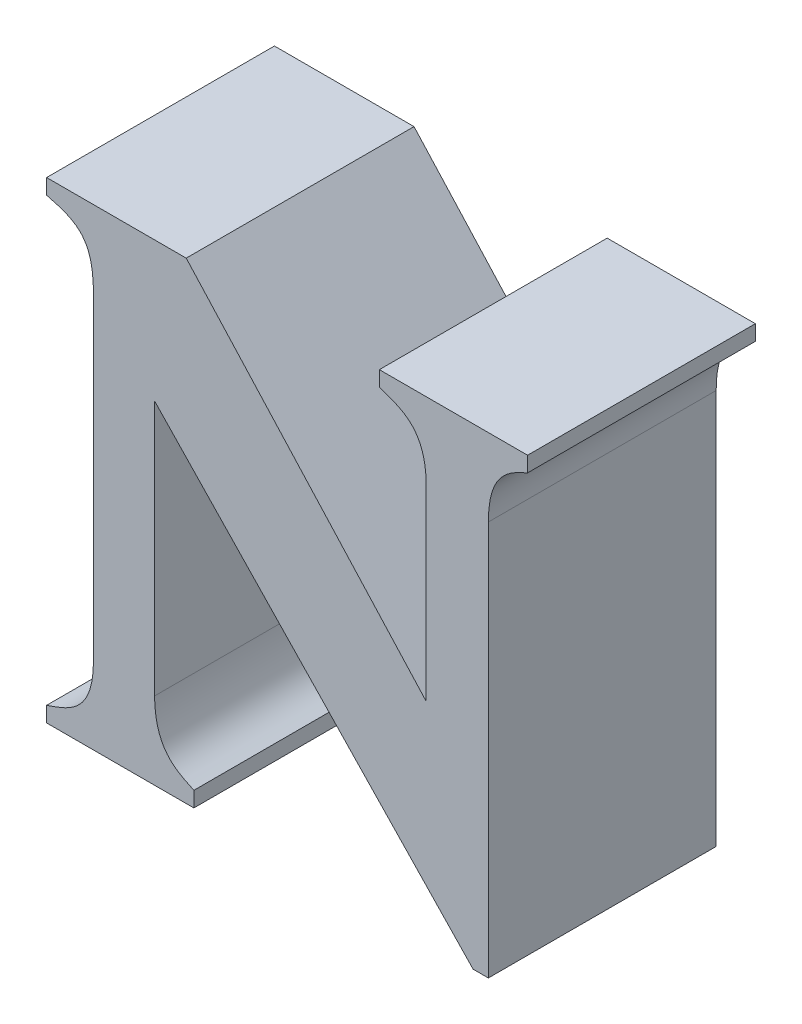
ISO-10303-21;
HEADER;
FILE_DESCRIPTION(('STEP AP214'),'2;1');
FILE_NAME('part.step','',(''),(''),'','','');
FILE_SCHEMA(('AUTOMOTIVE_DESIGN { 1 0 10303 214 1 1 1 1 }'));
ENDSEC;
DATA;
#1=APPLICATION_CONTEXT('core data for automotive mechanical design processes');
#2=APPLICATION_PROTOCOL_DEFINITION('international standard','automotive_design',2000,#1);
#3=PRODUCT_CONTEXT('',#1,'mechanical');
#4=PRODUCT('Part','Part','',(#3));
#5=PRODUCT_RELATED_PRODUCT_CATEGORY('part','',(#4));
#6=PRODUCT_DEFINITION_FORMATION('','',#4);
#7=PRODUCT_DEFINITION_CONTEXT('part definition',#1,'design');
#8=PRODUCT_DEFINITION('design','',#6,#7);
#9=PRODUCT_DEFINITION_SHAPE('','',#8);
#10=(LENGTH_UNIT() NAMED_UNIT(*) SI_UNIT(.MILLI.,.METRE.));
#11=(NAMED_UNIT(*) PLANE_ANGLE_UNIT() SI_UNIT($,.RADIAN.));
#12=(NAMED_UNIT(*) SI_UNIT($,.STERADIAN.) SOLID_ANGLE_UNIT());
#13=UNCERTAINTY_MEASURE_WITH_UNIT(LENGTH_MEASURE(1.E-05),#10,'distance_accuracy_value','');
#14=(GEOMETRIC_REPRESENTATION_CONTEXT(3) GLOBAL_UNCERTAINTY_ASSIGNED_CONTEXT((#13)) GLOBAL_UNIT_ASSIGNED_CONTEXT((#10,
#11,#12)) REPRESENTATION_CONTEXT('',''));
#15=CARTESIAN_POINT('',(0.,0.,0.));
#16=DIRECTION('',(0.,0.,1.));
#17=DIRECTION('',(1.,0.,0.));
#18=AXIS2_PLACEMENT_3D('',#15,#16,#17);
#19=CARTESIAN_POINT('',(2.447592086115,-0.453859050516,0.));
#20=DIRECTION('',(-1.,0.,0.));
#21=DIRECTION('',(0.,-1.,0.));
#22=AXIS2_PLACEMENT_3D('',#19,#20,#21);
#23=PLANE('',#22);
#24=DIRECTION('',(0.,1.,0.));
#25=VECTOR('',#24,1.);
#26=CARTESIAN_POINT('',(2.447592086115,-0.46057454398,0.));
#27=LINE('',#26,#25);
#28=CARTESIAN_POINT('',(2.447592086115,-0.46057454398,0.));
#29=VERTEX_POINT('',#28);
#30=CARTESIAN_POINT('',(2.447592086115,-0.453859050516,0.));
#31=VERTEX_POINT('',#30);
#32=EDGE_CURVE('E11',#29,#31,#27,.T.);
#33=ORIENTED_EDGE('',*,*,#32,.F.);
#34=DIRECTION('',(0.,0.,1.));
#35=VECTOR('',#34,1.);
#36=CARTESIAN_POINT('',(2.447592086115,-0.46057454398,0.));
#37=LINE('',#36,#35);
#38=CARTESIAN_POINT('',(2.447592086115,-0.46057454398,0.1));
#39=VERTEX_POINT('',#38);
#40=EDGE_CURVE('E24',#29,#39,#37,.T.);
#41=ORIENTED_EDGE('',*,*,#40,.T.);
#42=DIRECTION('',(0.,-1.,0.));
#43=VECTOR('',#42,1.);
#44=CARTESIAN_POINT('',(2.447592086115,-0.46057454398,0.1));
#45=LINE('',#44,#43);
#46=CARTESIAN_POINT('',(2.447592086115,-0.453859050516,0.1));
#47=VERTEX_POINT('',#46);
#48=EDGE_CURVE('E172',#47,#39,#45,.T.);
#49=ORIENTED_EDGE('',*,*,#48,.F.);
#50=DIRECTION('',(0.,0.,1.));
#51=VECTOR('',#50,1.);
#52=CARTESIAN_POINT('',(2.447592086115,-0.453859050516,0.));
#53=LINE('',#52,#51);
#54=EDGE_CURVE('E356',#31,#47,#53,.T.);
#55=ORIENTED_EDGE('',*,*,#54,.F.);
#56=EDGE_LOOP('',(#33,#41,#49,#55));
#57=FACE_BOUND('',#56,.T.);
#58=ADVANCED_FACE('F17',(#57),#23,.T.);
#59=CARTESIAN_POINT('',(2.468158415474,-0.426577508445,0.));
#60=CARTESIAN_POINT('',(2.468158415474,-0.426577508445,0.1));
#61=CARTESIAN_POINT('',(2.468158415474,-0.447143557053,0.));
#62=CARTESIAN_POINT('',(2.468158415474,-0.447143557053,0.1));
#63=CARTESIAN_POINT('',(2.457665778633,-0.450501256992,0.));
#64=CARTESIAN_POINT('',(2.457665778633,-0.450501256992,0.1));
#65=CARTESIAN_POINT('',(2.447592086115,-0.453859050516,0.));
#66=CARTESIAN_POINT('',(2.447592086115,-0.453859050516,0.1));
#67=B_SPLINE_SURFACE_WITH_KNOTS('',3,1,((#59,#60),(#61,#62),(#63,#64),(#65,#66)),.UNSPECIFIED.,
.F.,.F.,.F.,(4,4),(2,2),(-1.,0.),(0.,0.01),.UNSPECIFIED.);
#68=CARTESIAN_POINT('',(2.447592086115,-0.453859050516,0.));
#69=CARTESIAN_POINT('',(2.457665778633,-0.450501256992,0.));
#70=CARTESIAN_POINT('',(2.468158415474,-0.447143557053,0.));
#71=CARTESIAN_POINT('',(2.468158415474,-0.426577508445,0.));
#72=B_SPLINE_CURVE_WITH_KNOTS('',3,(#68,#69,#70,#71),.UNSPECIFIED.,.F.,.F.,(4,4),(0.,1.),.UNSPECIFIED.);
#73=CARTESIAN_POINT('',(2.468158415474,-0.426577508445,0.));
#74=VERTEX_POINT('',#73);
#75=EDGE_CURVE('E349',#31,#74,#72,.T.);
#76=CARTESIAN_POINT('',(2.468158415474,-0.426577508445,0.1));
#77=CARTESIAN_POINT('',(2.468158415474,-0.447143557053,0.1));
#78=CARTESIAN_POINT('',(2.457665778633,-0.450501256992,0.1));
#79=CARTESIAN_POINT('',(2.447592086115,-0.453859050516,0.1));
#80=B_SPLINE_CURVE_WITH_KNOTS('',3,(#76,#77,#78,#79),.UNSPECIFIED.,.F.,.F.,(4,4),(-1.,0.),.UNSPECIFIED.);
#81=CARTESIAN_POINT('',(2.468158415474,-0.426577508445,0.1));
#82=VERTEX_POINT('',#81);
#83=EDGE_CURVE('E345',#82,#47,#80,.T.);
#84=DIRECTION('',(0.,0.,1.));
#85=VECTOR('',#84,1.);
#86=CARTESIAN_POINT('',(2.468158415474,-0.426577508445,0.));
#87=LINE('',#86,#85);
#88=EDGE_CURVE('E342',#74,#82,#87,.T.);
#89=ORIENTED_EDGE('',*,*,#75,.F.);
#90=ORIENTED_EDGE('',*,*,#54,.T.);
#91=ORIENTED_EDGE('',*,*,#83,.F.);
#92=ORIENTED_EDGE('',*,*,#88,.F.);
#93=EDGE_LOOP('',(#89,#90,#91,#92));
#94=FACE_BOUND('',#93,.T.);
#95=ADVANCED_FACE('F429',(#94),#67,.T.);
#96=CARTESIAN_POINT('',(2.468158415474,-0.28723157278345,0.));
#97=DIRECTION('',(-1.,0.,0.));
#98=DIRECTION('',(0.,-1.,0.));
#99=AXIS2_PLACEMENT_3D('',#96,#97,#98);
#100=PLANE('',#99);
#101=DIRECTION('',(0.,1.,0.));
#102=VECTOR('',#101,1.);
#103=CARTESIAN_POINT('',(2.468158415474,-0.426577508445,0.));
#104=LINE('',#103,#102);
#105=CARTESIAN_POINT('',(2.468158415474,-0.28723157278345,0.));
#106=VERTEX_POINT('',#105);
#107=EDGE_CURVE('E340',#74,#106,#104,.T.);
#108=ORIENTED_EDGE('',*,*,#107,.F.);
#109=ORIENTED_EDGE('',*,*,#88,.T.);
#110=DIRECTION('',(0.,-1.,0.));
#111=VECTOR('',#110,1.);
#112=CARTESIAN_POINT('',(2.468158415474,-0.426577508445,0.1));
#113=LINE('',#112,#111);
#114=CARTESIAN_POINT('',(2.468158415474,-0.28723157278345,0.1));
#115=VERTEX_POINT('',#114);
#116=EDGE_CURVE('E337',#115,#82,#113,.T.);
#117=ORIENTED_EDGE('',*,*,#116,.F.);
#118=DIRECTION('',(0.,0.,1.));
#119=VECTOR('',#118,1.);
#120=CARTESIAN_POINT('',(2.468158415474,-0.28723157278345,0.));
#121=LINE('',#120,#119);
#122=EDGE_CURVE('E331',#106,#115,#121,.T.);
#123=ORIENTED_EDGE('',*,*,#122,.F.);
#124=EDGE_LOOP('',(#108,#109,#117,#123));
#125=FACE_BOUND('',#124,.T.);
#126=ADVANCED_FACE('F425',(#125),#100,.T.);
#127=CARTESIAN_POINT('',(2.447592086115,-0.25995003071244,0.));
#128=CARTESIAN_POINT('',(2.447592086115,-0.25995003071244,0.1));
#129=CARTESIAN_POINT('',(2.461022948263,-0.26330769945751,0.));
#130=CARTESIAN_POINT('',(2.461022948263,-0.26330769945751,0.1));
#131=CARTESIAN_POINT('',(2.468158415474,-0.26666549298124,0.));
#132=CARTESIAN_POINT('',(2.468158415474,-0.26666549298124,0.1));
#133=CARTESIAN_POINT('',(2.468158415474,-0.28723157278345,0.));
#134=CARTESIAN_POINT('',(2.468158415474,-0.28723157278345,0.1));
#135=B_SPLINE_SURFACE_WITH_KNOTS('',3,1,((#127,#128),(#129,#130),(#131,#132),(#133,#134)),
.UNSPECIFIED.,.F.,.F.,.F.,(4,4),(2,2),(-1.,0.),(0.,0.01),.UNSPECIFIED.);
#136=CARTESIAN_POINT('',(2.468158415474,-0.28723157278345,0.));
#137=CARTESIAN_POINT('',(2.468158415474,-0.26666549298124,0.));
#138=CARTESIAN_POINT('',(2.461022948263,-0.26330769945751,0.));
#139=CARTESIAN_POINT('',(2.447592086115,-0.25995003071244,0.));
#140=B_SPLINE_CURVE_WITH_KNOTS('',3,(#136,#137,#138,#139),.UNSPECIFIED.,.F.,.F.,(4,4),(0.,1.),.UNSPECIFIED.);
#141=CARTESIAN_POINT('',(2.447592086115,-0.25995003071244,0.));
#142=VERTEX_POINT('',#141);
#143=EDGE_CURVE('E324',#106,#142,#140,.T.);
#144=CARTESIAN_POINT('',(2.447592086115,-0.25995003071244,0.1));
#145=CARTESIAN_POINT('',(2.461022948263,-0.26330769945751,0.1));
#146=CARTESIAN_POINT('',(2.468158415474,-0.26666549298124,0.1));
#147=CARTESIAN_POINT('',(2.468158415474,-0.28723157278345,0.1));
#148=B_SPLINE_CURVE_WITH_KNOTS('',3,(#144,#145,#146,#147),.UNSPECIFIED.,.F.,.F.,(4,4),(-1.,0.),.UNSPECIFIED.);
#149=CARTESIAN_POINT('',(2.447592086115,-0.25995003071244,0.1));
#150=VERTEX_POINT('',#149);
#151=EDGE_CURVE('E319',#150,#115,#148,.T.);
#152=DIRECTION('',(0.,0.,1.));
#153=VECTOR('',#152,1.);
#154=CARTESIAN_POINT('',(2.447592086115,-0.25995003071244,0.));
#155=LINE('',#154,#153);
#156=EDGE_CURVE('E316',#142,#150,#155,.T.);
#157=ORIENTED_EDGE('',*,*,#143,.F.);
#158=ORIENTED_EDGE('',*,*,#122,.T.);
#159=ORIENTED_EDGE('',*,*,#151,.F.);
#160=ORIENTED_EDGE('',*,*,#156,.F.);
#161=EDGE_LOOP('',(#157,#158,#159,#160));
#162=FACE_BOUND('',#161,.T.);
#163=ADVANCED_FACE('F421',(#162),#135,.T.);
#164=CARTESIAN_POINT('',(2.447592086115,-0.25323453724898,0.));
#165=DIRECTION('',(-1.,0.,0.));
#166=DIRECTION('',(0.,-1.,0.));
#167=AXIS2_PLACEMENT_3D('',#164,#165,#166);
#168=PLANE('',#167);
#169=DIRECTION('',(0.,1.,0.));
#170=VECTOR('',#169,1.);
#171=CARTESIAN_POINT('',(2.447592086115,-0.25995003071244,0.));
#172=LINE('',#171,#170);
#173=CARTESIAN_POINT('',(2.447592086115,-0.25323453724898,0.));
#174=VERTEX_POINT('',#173);
#175=EDGE_CURVE('E314',#142,#174,#172,.T.);
#176=ORIENTED_EDGE('',*,*,#175,.F.);
#177=ORIENTED_EDGE('',*,*,#156,.T.);
#178=DIRECTION('',(0.,-1.,0.));
#179=VECTOR('',#178,1.);
#180=CARTESIAN_POINT('',(2.447592086115,-0.25995003071244,0.1));
#181=LINE('',#180,#179);
#182=CARTESIAN_POINT('',(2.447592086115,-0.25323453724898,0.1));
#183=VERTEX_POINT('',#182);
#184=EDGE_CURVE('E311',#183,#150,#181,.T.);
#185=ORIENTED_EDGE('',*,*,#184,.F.);
#186=DIRECTION('',(0.,0.,1.));
#187=VECTOR('',#186,1.);
#188=CARTESIAN_POINT('',(2.447592086115,-0.25323453724898,0.));
#189=LINE('',#188,#187);
#190=EDGE_CURVE('E308',#174,#183,#189,.T.);
#191=ORIENTED_EDGE('',*,*,#190,.F.);
#192=EDGE_LOOP('',(#176,#177,#185,#191));
#193=FACE_BOUND('',#192,.T.);
#194=ADVANCED_FACE('F417',(#193),#168,.T.);
#195=CARTESIAN_POINT('',(2.508870570136,-0.25323453724898,0.));
#196=DIRECTION('',(0.,1.,0.));
#197=DIRECTION('',(-1.,0.,0.));
#198=AXIS2_PLACEMENT_3D('',#195,#196,#197);
#199=PLANE('',#198);
#200=DIRECTION('',(1.,0.,0.));
#201=VECTOR('',#200,1.);
#202=CARTESIAN_POINT('',(2.447592086115,-0.25323453724898,0.));
#203=LINE('',#202,#201);
#204=CARTESIAN_POINT('',(2.508870570136,-0.25323453724898,0.));
#205=VERTEX_POINT('',#204);
#206=EDGE_CURVE('E306',#174,#205,#203,.T.);
#207=ORIENTED_EDGE('',*,*,#206,.F.);
#208=ORIENTED_EDGE('',*,*,#190,.T.);
#209=DIRECTION('',(-1.,0.,0.));
#210=VECTOR('',#209,1.);
#211=CARTESIAN_POINT('',(2.447592086115,-0.25323453724898,0.1));
#212=LINE('',#211,#210);
#213=CARTESIAN_POINT('',(2.508870570136,-0.25323453724898,0.1));
#214=VERTEX_POINT('',#213);
#215=EDGE_CURVE('E303',#214,#183,#212,.T.);
#216=ORIENTED_EDGE('',*,*,#215,.F.);
#217=DIRECTION('',(0.,0.,1.));
#218=VECTOR('',#217,1.);
#219=CARTESIAN_POINT('',(2.508870570136,-0.25323453724898,0.));
#220=LINE('',#219,#218);
#221=EDGE_CURVE('E300',#205,#214,#220,.T.);
#222=ORIENTED_EDGE('',*,*,#221,.F.);
#223=EDGE_LOOP('',(#207,#208,#216,#222));
#224=FACE_BOUND('',#223,.T.);
#225=ADVANCED_FACE('F413',(#224),#199,.T.);
#226=CARTESIAN_POINT('',(2.614219626237,-0.369076323775,0.));
#227=DIRECTION('',(0.73981818348661,0.672806848495594,0.));
#228=DIRECTION('',(-0.672806848495594,0.73981818348661,0.));
#229=AXIS2_PLACEMENT_3D('',#226,#227,#228);
#230=PLANE('',#229);
#231=DIRECTION('',(0.672806848495594,-0.73981818348661,0.));
#232=VECTOR('',#231,1.);
#233=CARTESIAN_POINT('',(2.508870570136,-0.25323453724898,0.));
#234=LINE('',#233,#232);
#235=CARTESIAN_POINT('',(2.614219626237,-0.369076323775,0.));
#236=VERTEX_POINT('',#235);
#237=EDGE_CURVE('E298',#205,#236,#234,.T.);
#238=ORIENTED_EDGE('',*,*,#237,.F.);
#239=ORIENTED_EDGE('',*,*,#221,.T.);
#240=DIRECTION('',(-0.672806848495594,0.73981818348661,0.));
#241=VECTOR('',#240,1.);
#242=CARTESIAN_POINT('',(2.508870570136,-0.25323453724898,0.1));
#243=LINE('',#242,#241);
#244=CARTESIAN_POINT('',(2.614219626237,-0.369076323775,0.1));
#245=VERTEX_POINT('',#244);
#246=EDGE_CURVE('E295',#245,#214,#243,.T.);
#247=ORIENTED_EDGE('',*,*,#246,.F.);
#248=DIRECTION('',(0.,0.,1.));
#249=VECTOR('',#248,1.);
#250=CARTESIAN_POINT('',(2.614219626237,-0.369076323775,0.));
#251=LINE('',#250,#249);
#252=EDGE_CURVE('E292',#236,#245,#251,.T.);
#253=ORIENTED_EDGE('',*,*,#252,.F.);
#254=EDGE_LOOP('',(#238,#239,#247,#253));
#255=FACE_BOUND('',#254,.T.);
#256=ADVANCED_FACE('F409',(#255),#230,.T.);
#257=CARTESIAN_POINT('',(2.614219626237,-0.28723157278345,0.));
#258=DIRECTION('',(-1.,0.,0.));
#259=DIRECTION('',(0.,-1.,0.));
#260=AXIS2_PLACEMENT_3D('',#257,#258,#259);
#261=PLANE('',#260);
#262=DIRECTION('',(0.,1.,0.));
#263=VECTOR('',#262,1.);
#264=CARTESIAN_POINT('',(2.614219626237,-0.369076323775,0.));
#265=LINE('',#264,#263);
#266=CARTESIAN_POINT('',(2.614219626237,-0.28723157278345,0.));
#267=VERTEX_POINT('',#266);
#268=EDGE_CURVE('E290',#236,#267,#265,.T.);
#269=ORIENTED_EDGE('',*,*,#268,.F.);
#270=ORIENTED_EDGE('',*,*,#252,.T.);
#271=DIRECTION('',(0.,-1.,0.));
#272=VECTOR('',#271,1.);
#273=CARTESIAN_POINT('',(2.614219626237,-0.369076323775,0.1));
#274=LINE('',#273,#272);
#275=CARTESIAN_POINT('',(2.614219626237,-0.28723157278345,0.1));
#276=VERTEX_POINT('',#275);
#277=EDGE_CURVE('E287',#276,#245,#274,.T.);
#278=ORIENTED_EDGE('',*,*,#277,.F.);
#279=DIRECTION('',(0.,0.,1.));
#280=VECTOR('',#279,1.);
#281=CARTESIAN_POINT('',(2.614219626237,-0.28723157278345,0.));
#282=LINE('',#281,#280);
#283=EDGE_CURVE('E281',#267,#276,#282,.T.);
#284=ORIENTED_EDGE('',*,*,#283,.F.);
#285=EDGE_LOOP('',(#269,#270,#278,#284));
#286=FACE_BOUND('',#285,.T.);
#287=ADVANCED_FACE('F405',(#286),#261,.T.);
#288=CARTESIAN_POINT('',(2.593653608824,-0.25995003071244,0.));
#289=CARTESIAN_POINT('',(2.593653608824,-0.25995003071244,0.1));
#290=CARTESIAN_POINT('',(2.604145933719,-0.26330769945751,0.));
#291=CARTESIAN_POINT('',(2.604145933719,-0.26330769945751,0.1));
#292=CARTESIAN_POINT('',(2.614219626237,-0.26666549298124,0.));
#293=CARTESIAN_POINT('',(2.614219626237,-0.26666549298124,0.1));
#294=CARTESIAN_POINT('',(2.614219626237,-0.28723157278345,0.));
#295=CARTESIAN_POINT('',(2.614219626237,-0.28723157278345,0.1));
#296=B_SPLINE_SURFACE_WITH_KNOTS('',3,1,((#288,#289),(#290,#291),(#292,#293),(#294,#295)),
.UNSPECIFIED.,.F.,.F.,.F.,(4,4),(2,2),(-1.,0.),(0.,0.01),.UNSPECIFIED.);
#297=CARTESIAN_POINT('',(2.614219626237,-0.28723157278345,0.));
#298=CARTESIAN_POINT('',(2.614219626237,-0.26666549298124,0.));
#299=CARTESIAN_POINT('',(2.604145933719,-0.26330769945751,0.));
#300=CARTESIAN_POINT('',(2.593653608824,-0.25995003071244,0.));
#301=B_SPLINE_CURVE_WITH_KNOTS('',3,(#297,#298,#299,#300),.UNSPECIFIED.,.F.,.F.,(4,4),(0.,1.),.UNSPECIFIED.);
#302=CARTESIAN_POINT('',(2.593653608824,-0.25995003071244,0.));
#303=VERTEX_POINT('',#302);
#304=EDGE_CURVE('E274',#267,#303,#301,.T.);
#305=CARTESIAN_POINT('',(2.593653608824,-0.25995003071244,0.1));
#306=CARTESIAN_POINT('',(2.604145933719,-0.26330769945751,0.1));
#307=CARTESIAN_POINT('',(2.614219626237,-0.26666549298124,0.1));
#308=CARTESIAN_POINT('',(2.614219626237,-0.28723157278345,0.1));
#309=B_SPLINE_CURVE_WITH_KNOTS('',3,(#305,#306,#307,#308),.UNSPECIFIED.,.F.,.F.,(4,4),(-1.,0.),.UNSPECIFIED.);
#310=CARTESIAN_POINT('',(2.593653608824,-0.25995003071244,0.1));
#311=VERTEX_POINT('',#310);
#312=EDGE_CURVE('E269',#311,#276,#309,.T.);
#313=DIRECTION('',(0.,0.,1.));
#314=VECTOR('',#313,1.);
#315=CARTESIAN_POINT('',(2.593653608824,-0.25995003071244,0.));
#316=LINE('',#315,#314);
#317=EDGE_CURVE('E266',#303,#311,#316,.T.);
#318=ORIENTED_EDGE('',*,*,#304,.F.);
#319=ORIENTED_EDGE('',*,*,#283,.T.);
#320=ORIENTED_EDGE('',*,*,#312,.F.);
#321=ORIENTED_EDGE('',*,*,#317,.F.);
#322=EDGE_LOOP('',(#318,#319,#320,#321));
#323=FACE_BOUND('',#322,.T.);
#324=ADVANCED_FACE('F401',(#323),#296,.T.);
#325=CARTESIAN_POINT('',(2.593653608824,-0.25323453724898,0.));
#326=DIRECTION('',(-1.,0.,0.));
#327=DIRECTION('',(0.,-1.,0.));
#328=AXIS2_PLACEMENT_3D('',#325,#326,#327);
#329=PLANE('',#328);
#330=DIRECTION('',(0.,1.,0.));
#331=VECTOR('',#330,1.);
#332=CARTESIAN_POINT('',(2.593653608824,-0.25995003071244,0.));
#333=LINE('',#332,#331);
#334=CARTESIAN_POINT('',(2.593653608824,-0.25323453724898,0.));
#335=VERTEX_POINT('',#334);
#336=EDGE_CURVE('E264',#303,#335,#333,.T.);
#337=ORIENTED_EDGE('',*,*,#336,.F.);
#338=ORIENTED_EDGE('',*,*,#317,.T.);
#339=DIRECTION('',(0.,-1.,0.));
#340=VECTOR('',#339,1.);
#341=CARTESIAN_POINT('',(2.593653608824,-0.25995003071244,0.1));
#342=LINE('',#341,#340);
#343=CARTESIAN_POINT('',(2.593653608824,-0.25323453724898,0.1));
#344=VERTEX_POINT('',#343);
#345=EDGE_CURVE('E261',#344,#311,#342,.T.);
#346=ORIENTED_EDGE('',*,*,#345,.F.);
#347=DIRECTION('',(0.,0.,1.));
#348=VECTOR('',#347,1.);
#349=CARTESIAN_POINT('',(2.593653608824,-0.25323453724898,0.));
#350=LINE('',#349,#348);
#351=EDGE_CURVE('E258',#335,#344,#350,.T.);
#352=ORIENTED_EDGE('',*,*,#351,.F.);
#353=EDGE_LOOP('',(#337,#338,#346,#352));
#354=FACE_BOUND('',#353,.T.);
#355=ADVANCED_FACE('F397',(#354),#329,.T.);
#356=CARTESIAN_POINT('',(2.65870914264,-0.25323453724898,0.));
#357=DIRECTION('',(0.,1.,0.));
#358=DIRECTION('',(-1.,0.,0.));
#359=AXIS2_PLACEMENT_3D('',#356,#357,#358);
#360=PLANE('',#359);
#361=DIRECTION('',(1.,0.,0.));
#362=VECTOR('',#361,1.);
#363=CARTESIAN_POINT('',(2.593653608824,-0.25323453724898,0.));
#364=LINE('',#363,#362);
#365=CARTESIAN_POINT('',(2.65870914264,-0.25323453724898,0.));
#366=VERTEX_POINT('',#365);
#367=EDGE_CURVE('E256',#335,#366,#364,.T.);
#368=ORIENTED_EDGE('',*,*,#367,.F.);
#369=ORIENTED_EDGE('',*,*,#351,.T.);
#370=DIRECTION('',(-1.,0.,0.));
#371=VECTOR('',#370,1.);
#372=CARTESIAN_POINT('',(2.593653608824,-0.25323453724898,0.1));
#373=LINE('',#372,#371);
#374=CARTESIAN_POINT('',(2.65870914264,-0.25323453724898,0.1));
#375=VERTEX_POINT('',#374);
#376=EDGE_CURVE('E253',#375,#344,#373,.T.);
#377=ORIENTED_EDGE('',*,*,#376,.F.);
#378=DIRECTION('',(0.,0.,1.));
#379=VECTOR('',#378,1.);
#380=CARTESIAN_POINT('',(2.65870914264,-0.25323453724898,0.));
#381=LINE('',#380,#379);
#382=EDGE_CURVE('E250',#366,#375,#381,.T.);
#383=ORIENTED_EDGE('',*,*,#382,.F.);
#384=EDGE_LOOP('',(#368,#369,#377,#383));
#385=FACE_BOUND('',#384,.T.);
#386=ADVANCED_FACE('F393',(#385),#360,.T.);
#387=CARTESIAN_POINT('',(2.65870914264,-0.25995003071244,0.));
#388=DIRECTION('',(1.,0.,0.));
#389=DIRECTION('',(0.,1.,0.));
#390=AXIS2_PLACEMENT_3D('',#387,#388,#389);
#391=PLANE('',#390);
#392=DIRECTION('',(0.,-1.,0.));
#393=VECTOR('',#392,1.);
#394=CARTESIAN_POINT('',(2.65870914264,-0.25323453724898,0.));
#395=LINE('',#394,#393);
#396=CARTESIAN_POINT('',(2.65870914264,-0.25995003071244,0.));
#397=VERTEX_POINT('',#396);
#398=EDGE_CURVE('E248',#366,#397,#395,.T.);
#399=ORIENTED_EDGE('',*,*,#398,.F.);
#400=ORIENTED_EDGE('',*,*,#382,.T.);
#401=DIRECTION('',(0.,1.,0.));
#402=VECTOR('',#401,1.);
#403=CARTESIAN_POINT('',(2.65870914264,-0.25323453724898,0.1));
#404=LINE('',#403,#402);
#405=CARTESIAN_POINT('',(2.65870914264,-0.25995003071244,0.1));
#406=VERTEX_POINT('',#405);
#407=EDGE_CURVE('E245',#406,#375,#404,.T.);
#408=ORIENTED_EDGE('',*,*,#407,.F.);
#409=DIRECTION('',(0.,0.,1.));
#410=VECTOR('',#409,1.);
#411=CARTESIAN_POINT('',(2.65870914264,-0.25995003071244,0.));
#412=LINE('',#411,#410);
#413=EDGE_CURVE('E239',#397,#406,#412,.T.);
#414=ORIENTED_EDGE('',*,*,#413,.F.);
#415=EDGE_LOOP('',(#399,#400,#408,#414));
#416=FACE_BOUND('',#415,.T.);
#417=ADVANCED_FACE('F389',(#416),#391,.T.);
#418=CARTESIAN_POINT('',(2.641501230697,-0.28723157278345,0.));
#419=CARTESIAN_POINT('',(2.641501230697,-0.28723157278345,0.1));
#420=CARTESIAN_POINT('',(2.641501230697,-0.26666549298124,0.));
#421=CARTESIAN_POINT('',(2.641501230697,-0.26666549298124,0.1));
#422=CARTESIAN_POINT('',(2.651574923215,-0.26330769945751,0.));
#423=CARTESIAN_POINT('',(2.651574923215,-0.26330769945751,0.1));
#424=CARTESIAN_POINT('',(2.65870914264,-0.25995003071244,0.));
#425=CARTESIAN_POINT('',(2.65870914264,-0.25995003071244,0.1));
#426=B_SPLINE_SURFACE_WITH_KNOTS('',3,1,((#418,#419),(#420,#421),(#422,#423),(#424,#425)),
.UNSPECIFIED.,.F.,.F.,.F.,(4,4),(2,2),(-1.,0.),(0.,0.01),.UNSPECIFIED.);
#427=CARTESIAN_POINT('',(2.65870914264,-0.25995003071244,0.));
#428=CARTESIAN_POINT('',(2.651574923215,-0.26330769945751,0.));
#429=CARTESIAN_POINT('',(2.641501230697,-0.26666549298124,0.));
#430=CARTESIAN_POINT('',(2.641501230697,-0.28723157278345,0.));
#431=B_SPLINE_CURVE_WITH_KNOTS('',3,(#427,#428,#429,#430),.UNSPECIFIED.,.F.,.F.,(4,4),(0.,1.),.UNSPECIFIED.);
#432=CARTESIAN_POINT('',(2.641501230697,-0.28723157278345,0.));
#433=VERTEX_POINT('',#432);
#434=EDGE_CURVE('E232',#397,#433,#431,.T.);
#435=CARTESIAN_POINT('',(2.641501230697,-0.28723157278345,0.1));
#436=CARTESIAN_POINT('',(2.641501230697,-0.26666549298124,0.1));
#437=CARTESIAN_POINT('',(2.651574923215,-0.26330769945751,0.1));
#438=CARTESIAN_POINT('',(2.65870914264,-0.25995003071244,0.1));
#439=B_SPLINE_CURVE_WITH_KNOTS('',3,(#435,#436,#437,#438),.UNSPECIFIED.,.F.,.F.,(4,4),(-1.,0.),.UNSPECIFIED.);
#440=CARTESIAN_POINT('',(2.641501230697,-0.28723157278345,0.1));
#441=VERTEX_POINT('',#440);
#442=EDGE_CURVE('E227',#441,#406,#439,.T.);
#443=DIRECTION('',(0.,0.,1.));
#444=VECTOR('',#443,1.);
#445=CARTESIAN_POINT('',(2.641501230697,-0.28723157278345,0.));
#446=LINE('',#445,#444);
#447=EDGE_CURVE('E224',#433,#441,#446,.T.);
#448=ORIENTED_EDGE('',*,*,#434,.F.);
#449=ORIENTED_EDGE('',*,*,#413,.T.);
#450=ORIENTED_EDGE('',*,*,#442,.F.);
#451=ORIENTED_EDGE('',*,*,#447,.F.);
#452=EDGE_LOOP('',(#448,#449,#450,#451));
#453=FACE_BOUND('',#452,.T.);
#454=ADVANCED_FACE('F385',(#453),#426,.T.);
#455=CARTESIAN_POINT('',(2.641501230697,-0.46057454398,0.));
#456=DIRECTION('',(1.,0.,0.));
#457=DIRECTION('',(0.,1.,0.));
#458=AXIS2_PLACEMENT_3D('',#455,#456,#457);
#459=PLANE('',#458);
#460=DIRECTION('',(0.,-1.,0.));
#461=VECTOR('',#460,1.);
#462=CARTESIAN_POINT('',(2.641501230697,-0.28723157278345,0.));
#463=LINE('',#462,#461);
#464=CARTESIAN_POINT('',(2.641501230697,-0.46057454398,0.));
#465=VERTEX_POINT('',#464);
#466=EDGE_CURVE('E222',#433,#465,#463,.T.);
#467=ORIENTED_EDGE('',*,*,#466,.F.);
#468=ORIENTED_EDGE('',*,*,#447,.T.);
#469=DIRECTION('',(0.,1.,0.));
#470=VECTOR('',#469,1.);
#471=CARTESIAN_POINT('',(2.641501230697,-0.28723157278345,0.1));
#472=LINE('',#471,#470);
#473=CARTESIAN_POINT('',(2.641501230697,-0.46057454398,0.1));
#474=VERTEX_POINT('',#473);
#475=EDGE_CURVE('E219',#474,#441,#472,.T.);
#476=ORIENTED_EDGE('',*,*,#475,.F.);
#477=DIRECTION('',(0.,0.,1.));
#478=VECTOR('',#477,1.);
#479=CARTESIAN_POINT('',(2.641501230697,-0.46057454398,0.));
#480=LINE('',#479,#478);
#481=EDGE_CURVE('E216',#465,#474,#480,.T.);
#482=ORIENTED_EDGE('',*,*,#481,.F.);
#483=EDGE_LOOP('',(#467,#468,#476,#482));
#484=FACE_BOUND('',#483,.T.);
#485=ADVANCED_FACE('F381',(#484),#459,.T.);
#486=CARTESIAN_POINT('',(2.634785955596,-0.46057454398,0.));
#487=DIRECTION('',(0.,-1.,0.));
#488=DIRECTION('',(1.,0.,0.));
#489=AXIS2_PLACEMENT_3D('',#486,#487,#488);
#490=PLANE('',#489);
#491=DIRECTION('',(-1.,0.,0.));
#492=VECTOR('',#491,1.);
#493=CARTESIAN_POINT('',(2.641501230697,-0.46057454398,0.));
#494=LINE('',#493,#492);
#495=CARTESIAN_POINT('',(2.634785955596,-0.46057454398,0.));
#496=VERTEX_POINT('',#495);
#497=EDGE_CURVE('E214',#465,#496,#494,.T.);
#498=ORIENTED_EDGE('',*,*,#497,.F.);
#499=ORIENTED_EDGE('',*,*,#481,.T.);
#500=DIRECTION('',(1.,0.,0.));
#501=VECTOR('',#500,1.);
#502=CARTESIAN_POINT('',(2.641501230697,-0.46057454398,0.1));
#503=LINE('',#502,#501);
#504=CARTESIAN_POINT('',(2.634785955596,-0.46057454398,0.1));
#505=VERTEX_POINT('',#504);
#506=EDGE_CURVE('E211',#505,#474,#503,.T.);
#507=ORIENTED_EDGE('',*,*,#506,.F.);
#508=DIRECTION('',(0.,0.,1.));
#509=VECTOR('',#508,1.);
#510=CARTESIAN_POINT('',(2.634785955596,-0.46057454398,0.));
#511=LINE('',#510,#509);
#512=EDGE_CURVE('E208',#496,#505,#511,.T.);
#513=ORIENTED_EDGE('',*,*,#512,.F.);
#514=EDGE_LOOP('',(#498,#499,#507,#513));
#515=FACE_BOUND('',#514,.T.);
#516=ADVANCED_FACE('F377',(#515),#490,.T.);
#517=CARTESIAN_POINT('',(2.495019827824,-0.314513114854,0.));
#518=DIRECTION('',(-0.722505463033566,-0.69136521165492,0.));
#519=DIRECTION('',(0.69136521165492,-0.722505463033566,0.));
#520=AXIS2_PLACEMENT_3D('',#517,#518,#519);
#521=PLANE('',#520);
#522=DIRECTION('',(-0.69136521165492,0.722505463033566,0.));
#523=VECTOR('',#522,1.);
#524=CARTESIAN_POINT('',(2.634785955596,-0.46057454398,0.));
#525=LINE('',#524,#523);
#526=CARTESIAN_POINT('',(2.495019827824,-0.314513114854,0.));
#527=VERTEX_POINT('',#526);
#528=EDGE_CURVE('E206',#496,#527,#525,.T.);
#529=ORIENTED_EDGE('',*,*,#528,.F.);
#530=ORIENTED_EDGE('',*,*,#512,.T.);
#531=DIRECTION('',(0.69136521165492,-0.722505463033566,0.));
#532=VECTOR('',#531,1.);
#533=CARTESIAN_POINT('',(2.634785955596,-0.46057454398,0.1));
#534=LINE('',#533,#532);
#535=CARTESIAN_POINT('',(2.495019827824,-0.314513114854,0.1));
#536=VERTEX_POINT('',#535);
#537=EDGE_CURVE('E203',#536,#505,#534,.T.);
#538=ORIENTED_EDGE('',*,*,#537,.F.);
#539=DIRECTION('',(0.,0.,1.));
#540=VECTOR('',#539,1.);
#541=CARTESIAN_POINT('',(2.495019827824,-0.314513114854,0.));
#542=LINE('',#541,#540);
#543=EDGE_CURVE('E200',#527,#536,#542,.T.);
#544=ORIENTED_EDGE('',*,*,#543,.F.);
#545=EDGE_LOOP('',(#529,#530,#538,#544));
#546=FACE_BOUND('',#545,.T.);
#547=ADVANCED_FACE('F373',(#546),#521,.T.);
#548=CARTESIAN_POINT('',(2.495019827824,-0.426577508445,0.));
#549=DIRECTION('',(1.,0.,0.));
#550=DIRECTION('',(0.,1.,0.));
#551=AXIS2_PLACEMENT_3D('',#548,#549,#550);
#552=PLANE('',#551);
#553=DIRECTION('',(0.,-1.,0.));
#554=VECTOR('',#553,1.);
#555=CARTESIAN_POINT('',(2.495019827824,-0.314513114854,0.));
#556=LINE('',#555,#554);
#557=CARTESIAN_POINT('',(2.495019827824,-0.426577508445,0.));
#558=VERTEX_POINT('',#557);
#559=EDGE_CURVE('E198',#527,#558,#556,.T.);
#560=ORIENTED_EDGE('',*,*,#559,.F.);
#561=ORIENTED_EDGE('',*,*,#543,.T.);
#562=DIRECTION('',(0.,1.,0.));
#563=VECTOR('',#562,1.);
#564=CARTESIAN_POINT('',(2.495019827824,-0.314513114854,0.1));
#565=LINE('',#564,#563);
#566=CARTESIAN_POINT('',(2.495019827824,-0.426577508445,0.1));
#567=VERTEX_POINT('',#566);
#568=EDGE_CURVE('E195',#567,#536,#565,.T.);
#569=ORIENTED_EDGE('',*,*,#568,.F.);
#570=DIRECTION('',(0.,0.,1.));
#571=VECTOR('',#570,1.);
#572=CARTESIAN_POINT('',(2.495019827824,-0.426577508445,0.));
#573=LINE('',#572,#571);
#574=EDGE_CURVE('E189',#558,#567,#573,.T.);
#575=ORIENTED_EDGE('',*,*,#574,.F.);
#576=EDGE_LOOP('',(#560,#561,#569,#575));
#577=FACE_BOUND('',#576,.T.);
#578=ADVANCED_FACE('F369',(#577),#552,.T.);
#579=CARTESIAN_POINT('',(2.512228987553,-0.453859050516,0.));
#580=CARTESIAN_POINT('',(2.512228987553,-0.453859050516,0.1));
#581=CARTESIAN_POINT('',(2.505513712453,-0.450501256992,0.));
#582=CARTESIAN_POINT('',(2.505513712453,-0.450501256992,0.1));
#583=CARTESIAN_POINT('',(2.495019827824,-0.447143557053,0.));
#584=CARTESIAN_POINT('',(2.495019827824,-0.447143557053,0.1));
#585=CARTESIAN_POINT('',(2.495019827824,-0.426577508445,0.));
#586=CARTESIAN_POINT('',(2.495019827824,-0.426577508445,0.1));
#587=B_SPLINE_SURFACE_WITH_KNOTS('',3,1,((#579,#580),(#581,#582),(#583,#584),(#585,#586)),
.UNSPECIFIED.,.F.,.F.,.F.,(4,4),(2,2),(-1.,0.),(0.,0.01),.UNSPECIFIED.);
#588=CARTESIAN_POINT('',(2.495019827824,-0.426577508445,0.));
#589=CARTESIAN_POINT('',(2.495019827824,-0.447143557053,0.));
#590=CARTESIAN_POINT('',(2.505513712453,-0.450501256992,0.));
#591=CARTESIAN_POINT('',(2.512228987553,-0.453859050516,0.));
#592=B_SPLINE_CURVE_WITH_KNOTS('',3,(#588,#589,#590,#591),.UNSPECIFIED.,.F.,.F.,(4,4),(0.,1.),.UNSPECIFIED.);
#593=CARTESIAN_POINT('',(2.512228987553,-0.453859050516,0.));
#594=VERTEX_POINT('',#593);
#595=EDGE_CURVE('E182',#558,#594,#592,.T.);
#596=CARTESIAN_POINT('',(2.512228987553,-0.453859050516,0.1));
#597=CARTESIAN_POINT('',(2.505513712453,-0.450501256992,0.1));
#598=CARTESIAN_POINT('',(2.495019827824,-0.447143557053,0.1));
#599=CARTESIAN_POINT('',(2.495019827824,-0.426577508445,0.1));
#600=B_SPLINE_CURVE_WITH_KNOTS('',3,(#596,#597,#598,#599),.UNSPECIFIED.,.F.,.F.,(4,4),(-1.,0.),.UNSPECIFIED.);
#601=CARTESIAN_POINT('',(2.512228987553,-0.453859050516,0.1));
#602=VERTEX_POINT('',#601);
#603=EDGE_CURVE('E178',#602,#567,#600,.T.);
#604=DIRECTION('',(0.,0.,1.));
#605=VECTOR('',#604,1.);
#606=CARTESIAN_POINT('',(2.512228987553,-0.453859050516,0.));
#607=LINE('',#606,#605);
#608=EDGE_CURVE('E157',#594,#602,#607,.T.);
#609=ORIENTED_EDGE('',*,*,#595,.F.);
#610=ORIENTED_EDGE('',*,*,#574,.T.);
#611=ORIENTED_EDGE('',*,*,#603,.F.);
#612=ORIENTED_EDGE('',*,*,#608,.F.);
#613=EDGE_LOOP('',(#609,#610,#611,#612));
#614=FACE_BOUND('',#613,.T.);
#615=ADVANCED_FACE('F367',(#614),#587,.T.);
#616=CARTESIAN_POINT('',(2.512228987553,-0.46057454398,0.));
#617=DIRECTION('',(1.,0.,0.));
#618=DIRECTION('',(0.,1.,0.));
#619=AXIS2_PLACEMENT_3D('',#616,#617,#618);
#620=PLANE('',#619);
#621=DIRECTION('',(0.,-1.,0.));
#622=VECTOR('',#621,1.);
#623=CARTESIAN_POINT('',(2.512228987553,-0.453859050516,0.));
#624=LINE('',#623,#622);
#625=CARTESIAN_POINT('',(2.512228987553,-0.46057454398,0.));
#626=VERTEX_POINT('',#625);
#627=EDGE_CURVE('E161',#594,#626,#624,.T.);
#628=ORIENTED_EDGE('',*,*,#627,.F.);
#629=ORIENTED_EDGE('',*,*,#608,.T.);
#630=DIRECTION('',(0.,1.,0.));
#631=VECTOR('',#630,1.);
#632=CARTESIAN_POINT('',(2.512228987553,-0.453859050516,0.1));
#633=LINE('',#632,#631);
#634=CARTESIAN_POINT('',(2.512228987553,-0.46057454398,0.1));
#635=VERTEX_POINT('',#634);
#636=EDGE_CURVE('E150',#635,#602,#633,.T.);
#637=ORIENTED_EDGE('',*,*,#636,.F.);
#638=DIRECTION('',(0.,0.,1.));
#639=VECTOR('',#638,1.);
#640=CARTESIAN_POINT('',(2.512228987553,-0.46057454398,0.));
#641=LINE('',#640,#639);
#642=EDGE_CURVE('E154',#626,#635,#641,.T.);
#643=ORIENTED_EDGE('',*,*,#642,.F.);
#644=EDGE_LOOP('',(#628,#629,#637,#643));
#645=FACE_BOUND('',#644,.T.);
#646=ADVANCED_FACE('F153',(#645),#620,.T.);
#647=CARTESIAN_POINT('',(2.447592086115,-0.46057454398,0.));
#648=DIRECTION('',(0.,-1.,0.));
#649=DIRECTION('',(1.,0.,0.));
#650=AXIS2_PLACEMENT_3D('',#647,#648,#649);
#651=PLANE('',#650);
#652=DIRECTION('',(-1.,0.,0.));
#653=VECTOR('',#652,1.);
#654=CARTESIAN_POINT('',(2.512228987553,-0.46057454398,0.));
#655=LINE('',#654,#653);
#656=EDGE_CURVE('E167',#626,#29,#655,.T.);
#657=ORIENTED_EDGE('',*,*,#656,.F.);
#658=ORIENTED_EDGE('',*,*,#642,.T.);
#659=DIRECTION('',(1.,0.,0.));
#660=VECTOR('',#659,1.);
#661=CARTESIAN_POINT('',(2.512228987553,-0.46057454398,0.1));
#662=LINE('',#661,#660);
#663=EDGE_CURVE('E166',#39,#635,#662,.T.);
#664=ORIENTED_EDGE('',*,*,#663,.F.);
#665=ORIENTED_EDGE('',*,*,#40,.F.);
#666=EDGE_LOOP('',(#657,#658,#664,#665));
#667=FACE_BOUND('',#666,.T.);
#668=ADVANCED_FACE('F165',(#667),#651,.T.);
#669=CARTESIAN_POINT('',(2.551796570071,-0.350647982648306,0.));
#670=DIRECTION('',(0.,0.,1.));
#671=DIRECTION('',(1.,0.,0.));
#672=AXIS2_PLACEMENT_3D('',#669,#670,#671);
#673=PLANE('',#672);
#674=ORIENTED_EDGE('',*,*,#656,.T.);
#675=ORIENTED_EDGE('',*,*,#32,.T.);
#676=ORIENTED_EDGE('',*,*,#75,.T.);
#677=ORIENTED_EDGE('',*,*,#107,.T.);
#678=ORIENTED_EDGE('',*,*,#143,.T.);
#679=ORIENTED_EDGE('',*,*,#175,.T.);
#680=ORIENTED_EDGE('',*,*,#206,.T.);
#681=ORIENTED_EDGE('',*,*,#237,.T.);
#682=ORIENTED_EDGE('',*,*,#268,.T.);
#683=ORIENTED_EDGE('',*,*,#304,.T.);
#684=ORIENTED_EDGE('',*,*,#336,.T.);
#685=ORIENTED_EDGE('',*,*,#367,.T.);
#686=ORIENTED_EDGE('',*,*,#398,.T.);
#687=ORIENTED_EDGE('',*,*,#434,.T.);
#688=ORIENTED_EDGE('',*,*,#466,.T.);
#689=ORIENTED_EDGE('',*,*,#497,.T.);
#690=ORIENTED_EDGE('',*,*,#528,.T.);
#691=ORIENTED_EDGE('',*,*,#559,.T.);
#692=ORIENTED_EDGE('',*,*,#595,.T.);
#693=ORIENTED_EDGE('',*,*,#627,.T.);
#694=EDGE_LOOP('',(#674,#675,#676,#677,#678,#679,#680,#681,#682,#683,#684,#685,#686,#687,#688,
#689,#690,#691,#692,#693));
#695=FACE_BOUND('',#694,.T.);
#696=ADVANCED_FACE('F362',(#695),#673,.F.);
#697=CARTESIAN_POINT('',(2.551796570071,-0.350647982648306,0.1));
#698=DIRECTION('',(0.,0.,1.));
#699=DIRECTION('',(1.,0.,0.));
#700=AXIS2_PLACEMENT_3D('',#697,#698,#699);
#701=PLANE('',#700);
#702=ORIENTED_EDGE('',*,*,#663,.T.);
#703=ORIENTED_EDGE('',*,*,#636,.T.);
#704=ORIENTED_EDGE('',*,*,#603,.T.);
#705=ORIENTED_EDGE('',*,*,#568,.T.);
#706=ORIENTED_EDGE('',*,*,#537,.T.);
#707=ORIENTED_EDGE('',*,*,#506,.T.);
#708=ORIENTED_EDGE('',*,*,#475,.T.);
#709=ORIENTED_EDGE('',*,*,#442,.T.);
#710=ORIENTED_EDGE('',*,*,#407,.T.);
#711=ORIENTED_EDGE('',*,*,#376,.T.);
#712=ORIENTED_EDGE('',*,*,#345,.T.);
#713=ORIENTED_EDGE('',*,*,#312,.T.);
#714=ORIENTED_EDGE('',*,*,#277,.T.);
#715=ORIENTED_EDGE('',*,*,#246,.T.);
#716=ORIENTED_EDGE('',*,*,#215,.T.);
#717=ORIENTED_EDGE('',*,*,#184,.T.);
#718=ORIENTED_EDGE('',*,*,#151,.T.);
#719=ORIENTED_EDGE('',*,*,#116,.T.);
#720=ORIENTED_EDGE('',*,*,#83,.T.);
#721=ORIENTED_EDGE('',*,*,#48,.T.);
#722=EDGE_LOOP('',(#702,#703,#704,#705,#706,#707,#708,#709,#710,#711,#712,#713,#714,#715,#716,
#717,#718,#719,#720,#721));
#723=FACE_BOUND('',#722,.T.);
#724=ADVANCED_FACE('F170',(#723),#701,.T.);
#725=CLOSED_SHELL('',(#58,#95,#126,#163,#194,#225,#256,#287,#324,#355,#386,#417,#454,#485,#516,
#547,#578,#615,#646,#668,#696,#724));
#726=MANIFOLD_SOLID_BREP('B1',#725);
#727=ADVANCED_BREP_SHAPE_REPRESENTATION('',(#18,#726),#14);
#728=SHAPE_DEFINITION_REPRESENTATION(#9,#727);
ENDSEC;
END-ISO-10303-21;
